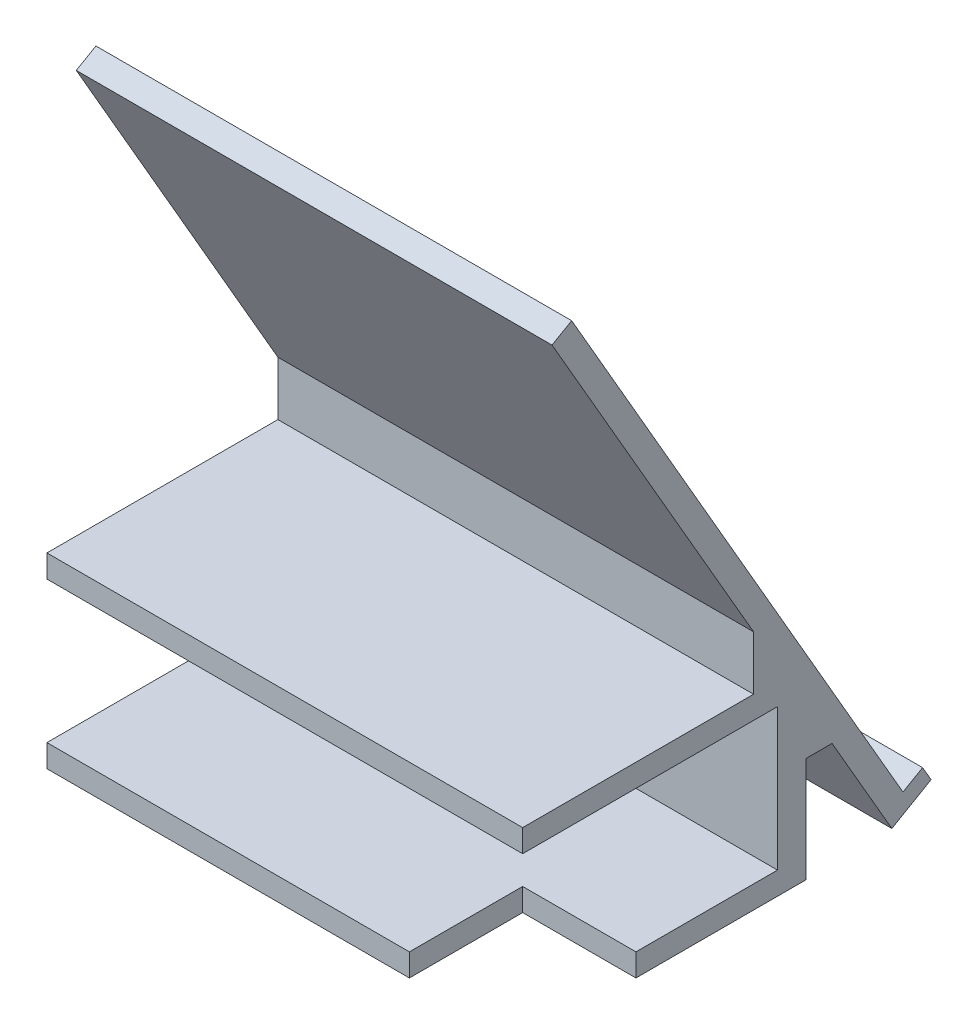
ISO-10303-21;
HEADER;
FILE_DESCRIPTION(('STEP AP214'),'2;1');
FILE_NAME('part.step','',(''),(''),'','','');
FILE_SCHEMA(('AUTOMOTIVE_DESIGN { 1 0 10303 214 1 1 1 1 }'));
ENDSEC;
DATA;
#1=APPLICATION_CONTEXT('core data for automotive mechanical design processes');
#2=APPLICATION_PROTOCOL_DEFINITION('international standard','automotive_design',2000,#1);
#3=PRODUCT_CONTEXT('',#1,'mechanical');
#4=PRODUCT('Part','Part','',(#3));
#5=PRODUCT_RELATED_PRODUCT_CATEGORY('part','',(#4));
#6=PRODUCT_DEFINITION_FORMATION('','',#4);
#7=PRODUCT_DEFINITION_CONTEXT('part definition',#1,'design');
#8=PRODUCT_DEFINITION('design','',#6,#7);
#9=PRODUCT_DEFINITION_SHAPE('','',#8);
#10=(LENGTH_UNIT() NAMED_UNIT(*) SI_UNIT(.MILLI.,.METRE.));
#11=(NAMED_UNIT(*) PLANE_ANGLE_UNIT() SI_UNIT($,.RADIAN.));
#12=(NAMED_UNIT(*) SI_UNIT($,.STERADIAN.) SOLID_ANGLE_UNIT());
#13=UNCERTAINTY_MEASURE_WITH_UNIT(LENGTH_MEASURE(1.E-05),#10,'distance_accuracy_value','');
#14=(GEOMETRIC_REPRESENTATION_CONTEXT(3) GLOBAL_UNCERTAINTY_ASSIGNED_CONTEXT((#13)) GLOBAL_UNIT_ASSIGNED_CONTEXT((#10,
#11,#12)) REPRESENTATION_CONTEXT('',''));
#15=CARTESIAN_POINT('',(0.,0.,0.));
#16=DIRECTION('',(0.,0.,1.));
#17=DIRECTION('',(1.,0.,0.));
#18=AXIS2_PLACEMENT_3D('',#15,#16,#17);
#19=CARTESIAN_POINT('',(0.,0.,0.));
#20=DIRECTION('',(1.,0.,0.));
#21=DIRECTION('',(0.,0.,-1.));
#22=AXIS2_PLACEMENT_3D('',#19,#20,#21);
#23=PLANE('',#22);
#24=DIRECTION('',(0.,0.,1.));
#25=VECTOR('',#24,1.);
#26=CARTESIAN_POINT('',(0.,33.,-50.));
#27=LINE('',#26,#25);
#28=CARTESIAN_POINT('',(0.,33.,-40.7782266286582));
#29=VERTEX_POINT('',#28);
#30=CARTESIAN_POINT('',(0.,33.,0.));
#31=VERTEX_POINT('',#30);
#32=EDGE_CURVE('E414',#29,#31,#27,.T.);
#33=ORIENTED_EDGE('',*,*,#32,.F.);
#34=DIRECTION('',(0.,1.,0.));
#35=VECTOR('',#34,1.);
#36=CARTESIAN_POINT('',(0.,42.5422927604196,-40.7782266286585));
#37=LINE('',#36,#35);
#38=CARTESIAN_POINT('',(0.,42.5422927604196,-40.7782266286527));
#39=VERTEX_POINT('',#38);
#40=EDGE_CURVE('E301',#29,#39,#37,.T.);
#41=ORIENTED_EDGE('',*,*,#40,.T.);
#42=DIRECTION('',(0.,-0.866025403784436,-0.500000000000004));
#43=VECTOR('',#42,1.);
#44=CARTESIAN_POINT('',(0.,28.2930632809514,-49.0050231043686));
#45=LINE('',#44,#43);
#46=CARTESIAN_POINT('',(0.,104.188591785399,-5.18671929203637));
#47=VERTEX_POINT('',#46);
#48=EDGE_CURVE('E273',#47,#39,#45,.T.);
#49=ORIENTED_EDGE('',*,*,#48,.F.);
#50=DIRECTION('',(0.,0.5,-0.866025403784438));
#51=VECTOR('',#50,1.);
#52=CARTESIAN_POINT('',(0.,75.895528504448,43.818303812332));
#53=LINE('',#52,#51);
#54=CARTESIAN_POINT('',(0.,106.188591785399,-8.65082090717412));
#55=VERTEX_POINT('',#54);
#56=EDGE_CURVE('E385',#47,#55,#53,.T.);
#57=ORIENTED_EDGE('',*,*,#56,.T.);
#58=DIRECTION('',(0.,-0.866025403784439,-0.5));
#59=VECTOR('',#58,1.);
#60=CARTESIAN_POINT('',(0.,30.2930632809509,-52.4691247195061));
#61=LINE('',#60,#59);
#62=CARTESIAN_POINT('',(0.,4.86361954262212,-67.1508209071785));
#63=VERTEX_POINT('',#62);
#64=EDGE_CURVE('E381',#55,#63,#61,.T.);
#65=ORIENTED_EDGE('',*,*,#64,.T.);
#66=DIRECTION('',(0.,0.500000000000001,-0.866025403784438));
#67=VECTOR('',#66,1.);
#68=CARTESIAN_POINT('',(0.,6.86361954262212,-70.6149225223162));
#69=LINE('',#68,#67);
#70=CARTESIAN_POINT('',(0.,6.86361954262212,-70.6149225223162));
#71=VERTEX_POINT('',#70);
#72=EDGE_CURVE('E311',#63,#71,#69,.T.);
#73=ORIENTED_EDGE('',*,*,#72,.T.);
#74=DIRECTION('',(0.,-0.866025403784438,-0.500000000000001));
#75=VECTOR('',#74,1.);
#76=CARTESIAN_POINT('',(0.,4.26554333126881,-72.1149225223162));
#77=LINE('',#76,#75);
#78=CARTESIAN_POINT('',(0.,4.26554333126881,-72.1149225223162));
#79=VERTEX_POINT('',#78);
#80=EDGE_CURVE('E308',#71,#79,#77,.T.);
#81=ORIENTED_EDGE('',*,*,#80,.T.);
#82=DIRECTION('',(0.,-0.5,0.866025403784439));
#83=VECTOR('',#82,1.);
#84=CARTESIAN_POINT('',(0.,-28.0275199496846,-16.181696187668));
#85=LINE('',#84,#83);
#86=CARTESIAN_POINT('',(0.,0.265543331266577,-65.1867192920369));
#87=VERTEX_POINT('',#86);
#88=EDGE_CURVE('E267',#79,#87,#85,.T.);
#89=ORIENTED_EDGE('',*,*,#88,.T.);
#90=CARTESIAN_POINT('',(0.,18.5527660011321,-54.6285863608651));
#91=VERTEX_POINT('',#90);
#92=EDGE_CURVE('E262',#91,#87,#45,.T.);
#93=ORIENTED_EDGE('',*,*,#92,.F.);
#94=DIRECTION('',(0.,0.,1.));
#95=VECTOR('',#94,1.);
#96=CARTESIAN_POINT('',(0.,18.5527660011321,-50.));
#97=LINE('',#96,#95);
#98=CARTESIAN_POINT('',(0.,18.5527660011321,-50.));
#99=VERTEX_POINT('',#98);
#100=EDGE_CURVE('E265',#91,#99,#97,.T.);
#101=ORIENTED_EDGE('',*,*,#100,.T.);
#102=DIRECTION('',(0.,1.,0.));
#103=VECTOR('',#102,1.);
#104=CARTESIAN_POINT('',(0.,0.,-50.));
#105=LINE('',#104,#103);
#106=CARTESIAN_POINT('',(0.,0.,-50.));
#107=VERTEX_POINT('',#106);
#108=EDGE_CURVE('E147',#107,#99,#105,.T.);
#109=ORIENTED_EDGE('',*,*,#108,.F.);
#110=DIRECTION('',(0.,0.,-1.));
#111=VECTOR('',#110,1.);
#112=CARTESIAN_POINT('',(0.,0.,0.));
#113=LINE('',#112,#111);
#114=CARTESIAN_POINT('',(0.,0.,0.));
#115=VERTEX_POINT('',#114);
#116=EDGE_CURVE('E352',#115,#107,#113,.T.);
#117=ORIENTED_EDGE('',*,*,#116,.F.);
#118=DIRECTION('',(0.,1.,0.));
#119=VECTOR('',#118,1.);
#120=CARTESIAN_POINT('',(0.,0.,0.));
#121=LINE('',#120,#119);
#122=CARTESIAN_POINT('',(0.,4.,0.));
#123=VERTEX_POINT('',#122);
#124=EDGE_CURVE('E442',#115,#123,#121,.T.);
#125=ORIENTED_EDGE('',*,*,#124,.T.);
#126=DIRECTION('',(0.,0.,-1.));
#127=VECTOR('',#126,1.);
#128=CARTESIAN_POINT('',(0.,4.,0.));
#129=LINE('',#128,#127);
#130=CARTESIAN_POINT('',(0.,4.,-45.));
#131=VERTEX_POINT('',#130);
#132=EDGE_CURVE('E348',#123,#131,#129,.T.);
#133=ORIENTED_EDGE('',*,*,#132,.T.);
#134=DIRECTION('',(0.,1.,0.));
#135=VECTOR('',#134,1.);
#136=CARTESIAN_POINT('',(0.,0.,-45.));
#137=LINE('',#136,#135);
#138=CARTESIAN_POINT('',(0.,29.,-45.));
#139=VERTEX_POINT('',#138);
#140=EDGE_CURVE('E389',#131,#139,#137,.T.);
#141=ORIENTED_EDGE('',*,*,#140,.T.);
#142=DIRECTION('',(0.,0.,1.));
#143=VECTOR('',#142,1.);
#144=CARTESIAN_POINT('',(0.,29.,-50.));
#145=LINE('',#144,#143);
#146=CARTESIAN_POINT('',(0.,29.,0.));
#147=VERTEX_POINT('',#146);
#148=EDGE_CURVE('E422',#139,#147,#145,.T.);
#149=ORIENTED_EDGE('',*,*,#148,.T.);
#150=DIRECTION('',(0.,-1.,0.));
#151=VECTOR('',#150,1.);
#152=CARTESIAN_POINT('',(0.,33.,0.));
#153=LINE('',#152,#151);
#154=EDGE_CURVE('E425',#31,#147,#153,.T.);
#155=ORIENTED_EDGE('',*,*,#154,.F.);
#156=EDGE_LOOP('',(#33,#41,#49,#57,#65,#73,#81,#89,#93,#101,#109,#117,#125,#133,#141,#149,#155));
#157=FACE_BOUND('',#156,.T.);
#158=ADVANCED_FACE('F131',(#157),#23,.F.);
#159=CARTESIAN_POINT('',(84.,0.,0.));
#160=DIRECTION('',(0.,1.,0.));
#161=DIRECTION('',(0.,0.,1.));
#162=AXIS2_PLACEMENT_3D('',#159,#160,#161);
#163=PLANE('',#162);
#164=DIRECTION('',(0.,0.,-1.));
#165=VECTOR('',#164,1.);
#166=CARTESIAN_POINT('',(84.,0.,0.));
#167=LINE('',#166,#165);
#168=CARTESIAN_POINT('',(84.,0.,-20.));
#169=VERTEX_POINT('',#168);
#170=CARTESIAN_POINT('',(84.,0.,-50.));
#171=VERTEX_POINT('',#170);
#172=EDGE_CURVE('E372',#169,#171,#167,.T.);
#173=ORIENTED_EDGE('',*,*,#172,.F.);
#174=DIRECTION('',(1.,0.,0.));
#175=VECTOR('',#174,1.);
#176=CARTESIAN_POINT('',(64.,0.,-20.));
#177=LINE('',#176,#175);
#178=CARTESIAN_POINT('',(64.,0.,-20.));
#179=VERTEX_POINT('',#178);
#180=EDGE_CURVE('E335',#179,#169,#177,.T.);
#181=ORIENTED_EDGE('',*,*,#180,.F.);
#182=DIRECTION('',(0.,0.,-1.));
#183=VECTOR('',#182,1.);
#184=CARTESIAN_POINT('',(64.,0.,0.));
#185=LINE('',#184,#183);
#186=CARTESIAN_POINT('',(64.,0.,0.));
#187=VERTEX_POINT('',#186);
#188=EDGE_CURVE('E315',#187,#179,#185,.T.);
#189=ORIENTED_EDGE('',*,*,#188,.F.);
#190=DIRECTION('',(-1.,0.,0.));
#191=VECTOR('',#190,1.);
#192=CARTESIAN_POINT('',(84.,0.,0.));
#193=LINE('',#192,#191);
#194=EDGE_CURVE('E441',#187,#115,#193,.T.);
#195=ORIENTED_EDGE('',*,*,#194,.T.);
#196=ORIENTED_EDGE('',*,*,#116,.T.);
#197=DIRECTION('',(-1.,0.,0.));
#198=VECTOR('',#197,1.);
#199=CARTESIAN_POINT('',(84.,0.,-50.));
#200=LINE('',#199,#198);
#201=EDGE_CURVE('E375',#171,#107,#200,.T.);
#202=ORIENTED_EDGE('',*,*,#201,.F.);
#203=EDGE_LOOP('',(#173,#181,#189,#195,#196,#202));
#204=FACE_BOUND('',#203,.T.);
#205=ADVANCED_FACE('F467',(#204),#163,.F.);
#206=CARTESIAN_POINT('',(84.,0.,0.));
#207=DIRECTION('',(1.,0.,0.));
#208=DIRECTION('',(0.,0.,-1.));
#209=AXIS2_PLACEMENT_3D('',#206,#207,#208);
#210=PLANE('',#209);
#211=DIRECTION('',(0.,1.,0.));
#212=VECTOR('',#211,1.);
#213=CARTESIAN_POINT('',(84.,0.,-50.));
#214=LINE('',#213,#212);
#215=CARTESIAN_POINT('',(84.,18.5527660011321,-50.));
#216=VERTEX_POINT('',#215);
#217=EDGE_CURVE('E349',#171,#216,#214,.T.);
#218=ORIENTED_EDGE('',*,*,#217,.T.);
#219=DIRECTION('',(0.,0.,-1.));
#220=VECTOR('',#219,1.);
#221=CARTESIAN_POINT('',(84.,18.5527660011321,-50.));
#222=LINE('',#221,#220);
#223=CARTESIAN_POINT('',(84.,18.5527660011321,-54.6285863608593));
#224=VERTEX_POINT('',#223);
#225=EDGE_CURVE('E292',#216,#224,#222,.T.);
#226=ORIENTED_EDGE('',*,*,#225,.T.);
#227=DIRECTION('',(0.,-0.866025403784436,-0.500000000000004));
#228=VECTOR('',#227,1.);
#229=CARTESIAN_POINT('',(84.,28.2930632809514,-49.0050231043686));
#230=LINE('',#229,#228);
#231=CARTESIAN_POINT('',(84.,0.265543331266577,-65.1867192920369));
#232=VERTEX_POINT('',#231);
#233=EDGE_CURVE('E277',#224,#232,#230,.T.);
#234=ORIENTED_EDGE('',*,*,#233,.T.);
#235=DIRECTION('',(0.,-0.5,0.866025403784439));
#236=VECTOR('',#235,1.);
#237=CARTESIAN_POINT('',(84.,-28.0275199496846,-16.181696187668));
#238=LINE('',#237,#236);
#239=CARTESIAN_POINT('',(84.,4.26554333126881,-72.1149225223162));
#240=VERTEX_POINT('',#239);
#241=EDGE_CURVE('E355',#240,#232,#238,.T.);
#242=ORIENTED_EDGE('',*,*,#241,.F.);
#243=DIRECTION('',(0.,0.866025403784438,0.500000000000001));
#244=VECTOR('',#243,1.);
#245=CARTESIAN_POINT('',(84.,4.26554333126881,-72.1149225223162));
#246=LINE('',#245,#244);
#247=CARTESIAN_POINT('',(84.,6.86361954262212,-70.6149225223162));
#248=VERTEX_POINT('',#247);
#249=EDGE_CURVE('E307',#240,#248,#246,.T.);
#250=ORIENTED_EDGE('',*,*,#249,.T.);
#251=DIRECTION('',(0.,-0.500000000000001,0.866025403784438));
#252=VECTOR('',#251,1.);
#253=CARTESIAN_POINT('',(84.,6.86361954262212,-70.6149225223162));
#254=LINE('',#253,#252);
#255=CARTESIAN_POINT('',(84.,4.86361954262212,-67.1508209071785));
#256=VERTEX_POINT('',#255);
#257=EDGE_CURVE('E319',#248,#256,#254,.T.);
#258=ORIENTED_EDGE('',*,*,#257,.T.);
#259=DIRECTION('',(0.,-0.866025403784439,-0.5));
#260=VECTOR('',#259,1.);
#261=CARTESIAN_POINT('',(84.,30.2930632809509,-52.4691247195061));
#262=LINE('',#261,#260);
#263=CARTESIAN_POINT('',(84.,106.188591785399,-8.65082090717412));
#264=VERTEX_POINT('',#263);
#265=EDGE_CURVE('E360',#264,#256,#262,.T.);
#266=ORIENTED_EDGE('',*,*,#265,.F.);
#267=DIRECTION('',(0.,0.5,-0.866025403784438));
#268=VECTOR('',#267,1.);
#269=CARTESIAN_POINT('',(84.,75.895528504448,43.818303812332));
#270=LINE('',#269,#268);
#271=CARTESIAN_POINT('',(84.,104.188591785399,-5.18671929203637));
#272=VERTEX_POINT('',#271);
#273=EDGE_CURVE('E364',#272,#264,#270,.T.);
#274=ORIENTED_EDGE('',*,*,#273,.F.);
#275=CARTESIAN_POINT('',(84.,42.5422927604196,-40.7782266286527));
#276=VERTEX_POINT('',#275);
#277=EDGE_CURVE('E356',#272,#276,#230,.T.);
#278=ORIENTED_EDGE('',*,*,#277,.T.);
#279=DIRECTION('',(0.,-1.,0.));
#280=VECTOR('',#279,1.);
#281=CARTESIAN_POINT('',(84.,42.5422927604196,-40.7782266286585));
#282=LINE('',#281,#280);
#283=CARTESIAN_POINT('',(84.,33.,-40.7782266286582));
#284=VERTEX_POINT('',#283);
#285=EDGE_CURVE('E285',#276,#284,#282,.T.);
#286=ORIENTED_EDGE('',*,*,#285,.T.);
#287=DIRECTION('',(0.,0.,1.));
#288=VECTOR('',#287,1.);
#289=CARTESIAN_POINT('',(84.,33.,-50.));
#290=LINE('',#289,#288);
#291=CARTESIAN_POINT('',(84.,33.,0.));
#292=VERTEX_POINT('',#291);
#293=EDGE_CURVE('E418',#284,#292,#290,.T.);
#294=ORIENTED_EDGE('',*,*,#293,.T.);
#295=DIRECTION('',(0.,-1.,0.));
#296=VECTOR('',#295,1.);
#297=CARTESIAN_POINT('',(84.,33.,0.));
#298=LINE('',#297,#296);
#299=CARTESIAN_POINT('',(84.,29.,0.));
#300=VERTEX_POINT('',#299);
#301=EDGE_CURVE('E413',#292,#300,#298,.T.);
#302=ORIENTED_EDGE('',*,*,#301,.T.);
#303=DIRECTION('',(0.,0.,1.));
#304=VECTOR('',#303,1.);
#305=CARTESIAN_POINT('',(84.,29.,-50.));
#306=LINE('',#305,#304);
#307=CARTESIAN_POINT('',(84.,29.,-45.));
#308=VERTEX_POINT('',#307);
#309=EDGE_CURVE('E410',#308,#300,#306,.T.);
#310=ORIENTED_EDGE('',*,*,#309,.F.);
#311=DIRECTION('',(0.,1.,0.));
#312=VECTOR('',#311,1.);
#313=CARTESIAN_POINT('',(84.,0.,-45.));
#314=LINE('',#313,#312);
#315=CARTESIAN_POINT('',(84.,4.,-45.));
#316=VERTEX_POINT('',#315);
#317=EDGE_CURVE('E368',#316,#308,#314,.T.);
#318=ORIENTED_EDGE('',*,*,#317,.F.);
#319=DIRECTION('',(0.,0.,-1.));
#320=VECTOR('',#319,1.);
#321=CARTESIAN_POINT('',(84.,4.,0.));
#322=LINE('',#321,#320);
#323=CARTESIAN_POINT('',(84.,4.,-20.));
#324=VERTEX_POINT('',#323);
#325=EDGE_CURVE('E438',#324,#316,#322,.T.);
#326=ORIENTED_EDGE('',*,*,#325,.F.);
#327=DIRECTION('',(0.,-1.,0.));
#328=VECTOR('',#327,1.);
#329=CARTESIAN_POINT('',(84.,14.,-20.));
#330=LINE('',#329,#328);
#331=EDGE_CURVE('E339',#324,#169,#330,.T.);
#332=ORIENTED_EDGE('',*,*,#331,.T.);
#333=ORIENTED_EDGE('',*,*,#172,.T.);
#334=EDGE_LOOP('',(#218,#226,#234,#242,#250,#258,#266,#274,#278,#286,#294,#302,#310,#318,#326,
#332,#333));
#335=FACE_BOUND('',#334,.T.);
#336=ADVANCED_FACE('F476',(#335),#210,.T.);
#337=CARTESIAN_POINT('',(84.,0.,-50.));
#338=DIRECTION('',(0.,0.,1.));
#339=DIRECTION('',(1.,0.,0.));
#340=AXIS2_PLACEMENT_3D('',#337,#338,#339);
#341=PLANE('',#340);
#342=ORIENTED_EDGE('',*,*,#108,.T.);
#343=DIRECTION('',(1.,0.,0.));
#344=VECTOR('',#343,1.);
#345=CARTESIAN_POINT('',(-11.0184905878263,18.5527660011321,-50.));
#346=LINE('',#345,#344);
#347=EDGE_CURVE('E152',#99,#216,#346,.T.);
#348=ORIENTED_EDGE('',*,*,#347,.T.);
#349=ORIENTED_EDGE('',*,*,#217,.F.);
#350=ORIENTED_EDGE('',*,*,#201,.T.);
#351=EDGE_LOOP('',(#342,#348,#349,#350));
#352=FACE_BOUND('',#351,.T.);
#353=ADVANCED_FACE('F474',(#352),#341,.F.);
#354=CARTESIAN_POINT('',(84.,28.2930632809514,-49.0050231043686));
#355=DIRECTION('',(0.,0.500000000000004,-0.866025403784436));
#356=DIRECTION('',(0.,0.866025403784436,0.500000000000004));
#357=AXIS2_PLACEMENT_3D('',#354,#355,#356);
#358=PLANE('',#357);
#359=ORIENTED_EDGE('',*,*,#233,.F.);
#360=DIRECTION('',(1.,0.,0.));
#361=VECTOR('',#360,1.);
#362=CARTESIAN_POINT('',(-11.0184905878263,18.5527660011321,-54.6285863608651));
#363=LINE('',#362,#361);
#364=EDGE_CURVE('E275',#91,#224,#363,.T.);
#365=ORIENTED_EDGE('',*,*,#364,.F.);
#366=ORIENTED_EDGE('',*,*,#92,.T.);
#367=DIRECTION('',(-1.,0.,0.));
#368=VECTOR('',#367,1.);
#369=CARTESIAN_POINT('',(84.,0.265543331266577,-65.1867192920369));
#370=LINE('',#369,#368);
#371=EDGE_CURVE('E406',#232,#87,#370,.T.);
#372=ORIENTED_EDGE('',*,*,#371,.F.);
#373=EDGE_LOOP('',(#359,#365,#366,#372));
#374=FACE_BOUND('',#373,.T.);
#375=ADVANCED_FACE('F276',(#374),#358,.F.);
#376=CARTESIAN_POINT('',(84.,-28.0275199496846,-16.181696187668));
#377=DIRECTION('',(0.,-0.866025403784439,-0.5));
#378=DIRECTION('',(0.,0.5,-0.866025403784439));
#379=AXIS2_PLACEMENT_3D('',#376,#377,#378);
#380=PLANE('',#379);
#381=ORIENTED_EDGE('',*,*,#88,.F.);
#382=DIRECTION('',(1.,0.,0.));
#383=VECTOR('',#382,1.);
#384=CARTESIAN_POINT('',(-11.0184905878263,4.26554333126881,-72.1149225223162));
#385=LINE('',#384,#383);
#386=EDGE_CURVE('E323',#79,#240,#385,.T.);
#387=ORIENTED_EDGE('',*,*,#386,.T.);
#388=ORIENTED_EDGE('',*,*,#241,.T.);
#389=ORIENTED_EDGE('',*,*,#371,.T.);
#390=EDGE_LOOP('',(#381,#387,#388,#389));
#391=FACE_BOUND('',#390,.T.);
#392=ADVANCED_FACE('F527',(#391),#380,.T.);
#393=CARTESIAN_POINT('',(84.,30.2930632809509,-52.4691247195061));
#394=DIRECTION('',(0.,0.5,-0.866025403784439));
#395=DIRECTION('',(0.,0.866025403784439,0.5));
#396=AXIS2_PLACEMENT_3D('',#393,#394,#395);
#397=PLANE('',#396);
#398=DIRECTION('',(1.,0.,0.));
#399=VECTOR('',#398,1.);
#400=CARTESIAN_POINT('',(-11.0184905878263,4.86361954262212,-67.1508209071785));
#401=LINE('',#400,#399);
#402=EDGE_CURVE('E312',#63,#256,#401,.T.);
#403=ORIENTED_EDGE('',*,*,#402,.F.);
#404=ORIENTED_EDGE('',*,*,#64,.F.);
#405=DIRECTION('',(-1.,0.,0.));
#406=VECTOR('',#405,1.);
#407=CARTESIAN_POINT('',(84.,106.188591785399,-8.65082090717412));
#408=LINE('',#407,#406);
#409=EDGE_CURVE('E403',#264,#55,#408,.T.);
#410=ORIENTED_EDGE('',*,*,#409,.F.);
#411=ORIENTED_EDGE('',*,*,#265,.T.);
#412=EDGE_LOOP('',(#403,#404,#410,#411));
#413=FACE_BOUND('',#412,.T.);
#414=ADVANCED_FACE('F516',(#413),#397,.T.);
#415=CARTESIAN_POINT('',(84.,75.895528504448,43.818303812332));
#416=DIRECTION('',(0.,0.866025403784438,0.5));
#417=DIRECTION('',(0.,-0.5,0.866025403784439));
#418=AXIS2_PLACEMENT_3D('',#415,#416,#417);
#419=PLANE('',#418);
#420=ORIENTED_EDGE('',*,*,#56,.F.);
#421=DIRECTION('',(-1.,0.,0.));
#422=VECTOR('',#421,1.);
#423=CARTESIAN_POINT('',(84.,104.188591785399,-5.18671929203637));
#424=LINE('',#423,#422);
#425=EDGE_CURVE('E400',#272,#47,#424,.T.);
#426=ORIENTED_EDGE('',*,*,#425,.F.);
#427=ORIENTED_EDGE('',*,*,#273,.T.);
#428=ORIENTED_EDGE('',*,*,#409,.T.);
#429=EDGE_LOOP('',(#420,#426,#427,#428));
#430=FACE_BOUND('',#429,.T.);
#431=ADVANCED_FACE('F509',(#430),#419,.T.);
#432=ORIENTED_EDGE('',*,*,#48,.T.);
#433=DIRECTION('',(1.,0.,0.));
#434=VECTOR('',#433,1.);
#435=CARTESIAN_POINT('',(-11.0184905878263,42.5422927604196,-40.7782266286585));
#436=LINE('',#435,#434);
#437=EDGE_CURVE('E289',#39,#276,#436,.T.);
#438=ORIENTED_EDGE('',*,*,#437,.T.);
#439=ORIENTED_EDGE('',*,*,#277,.F.);
#440=ORIENTED_EDGE('',*,*,#425,.T.);
#441=EDGE_LOOP('',(#432,#438,#439,#440));
#442=FACE_BOUND('',#441,.T.);
#443=ADVANCED_FACE('F536',(#442),#358,.F.);
#444=CARTESIAN_POINT('',(84.,0.,-45.));
#445=DIRECTION('',(0.,0.,1.));
#446=DIRECTION('',(1.,0.,0.));
#447=AXIS2_PLACEMENT_3D('',#444,#445,#446);
#448=PLANE('',#447);
#449=DIRECTION('',(-1.,0.,0.));
#450=VECTOR('',#449,1.);
#451=CARTESIAN_POINT('',(84.,4.,-45.));
#452=LINE('',#451,#450);
#453=EDGE_CURVE('E409',#316,#131,#452,.T.);
#454=ORIENTED_EDGE('',*,*,#453,.F.);
#455=ORIENTED_EDGE('',*,*,#317,.T.);
#456=DIRECTION('',(-1.,0.,0.));
#457=VECTOR('',#456,1.);
#458=CARTESIAN_POINT('',(84.,29.,-45.));
#459=LINE('',#458,#457);
#460=EDGE_CURVE('E397',#308,#139,#459,.T.);
#461=ORIENTED_EDGE('',*,*,#460,.T.);
#462=ORIENTED_EDGE('',*,*,#140,.F.);
#463=EDGE_LOOP('',(#454,#455,#461,#462));
#464=FACE_BOUND('',#463,.T.);
#465=ADVANCED_FACE('F485',(#464),#448,.T.);
#466=CARTESIAN_POINT('',(84.,4.,0.));
#467=DIRECTION('',(0.,1.,0.));
#468=DIRECTION('',(0.,0.,1.));
#469=AXIS2_PLACEMENT_3D('',#466,#467,#468);
#470=PLANE('',#469);
#471=DIRECTION('',(-1.,0.,0.));
#472=VECTOR('',#471,1.);
#473=CARTESIAN_POINT('',(84.,4.,-20.));
#474=LINE('',#473,#472);
#475=CARTESIAN_POINT('',(64.,4.,-20.));
#476=VERTEX_POINT('',#475);
#477=EDGE_CURVE('E12',#324,#476,#474,.T.);
#478=ORIENTED_EDGE('',*,*,#477,.F.);
#479=ORIENTED_EDGE('',*,*,#325,.T.);
#480=ORIENTED_EDGE('',*,*,#453,.T.);
#481=ORIENTED_EDGE('',*,*,#132,.F.);
#482=DIRECTION('',(-1.,0.,0.));
#483=VECTOR('',#482,1.);
#484=CARTESIAN_POINT('',(84.,4.,0.));
#485=LINE('',#484,#483);
#486=CARTESIAN_POINT('',(64.,4.,0.));
#487=VERTEX_POINT('',#486);
#488=EDGE_CURVE('E426',#487,#123,#485,.T.);
#489=ORIENTED_EDGE('',*,*,#488,.F.);
#490=DIRECTION('',(0.,0.,1.));
#491=VECTOR('',#490,1.);
#492=CARTESIAN_POINT('',(64.,4.,0.));
#493=LINE('',#492,#491);
#494=EDGE_CURVE('E343',#476,#487,#493,.T.);
#495=ORIENTED_EDGE('',*,*,#494,.F.);
#496=EDGE_LOOP('',(#478,#479,#480,#481,#489,#495));
#497=FACE_BOUND('',#496,.T.);
#498=ADVANCED_FACE('F133',(#497),#470,.T.);
#499=CARTESIAN_POINT('',(84.,0.,0.));
#500=DIRECTION('',(0.,0.,1.));
#501=DIRECTION('',(1.,0.,0.));
#502=AXIS2_PLACEMENT_3D('',#499,#500,#501);
#503=PLANE('',#502);
#504=DIRECTION('',(0.,-1.,0.));
#505=VECTOR('',#504,1.);
#506=CARTESIAN_POINT('',(64.,0.,0.));
#507=LINE('',#506,#505);
#508=EDGE_CURVE('E140',#487,#187,#507,.T.);
#509=ORIENTED_EDGE('',*,*,#508,.F.);
#510=ORIENTED_EDGE('',*,*,#488,.T.);
#511=ORIENTED_EDGE('',*,*,#124,.F.);
#512=ORIENTED_EDGE('',*,*,#194,.F.);
#513=EDGE_LOOP('',(#509,#510,#511,#512));
#514=FACE_BOUND('',#513,.T.);
#515=ADVANCED_FACE('F470',(#514),#503,.T.);
#516=CARTESIAN_POINT('',(84.,33.,-50.));
#517=DIRECTION('',(0.,-1.,0.));
#518=DIRECTION('',(0.,0.,-1.));
#519=AXIS2_PLACEMENT_3D('',#516,#517,#518);
#520=PLANE('',#519);
#521=ORIENTED_EDGE('',*,*,#293,.F.);
#522=DIRECTION('',(1.,0.,0.));
#523=VECTOR('',#522,1.);
#524=CARTESIAN_POINT('',(-11.0184905878263,33.,-40.7782266286582));
#525=LINE('',#524,#523);
#526=EDGE_CURVE('E297',#29,#284,#525,.T.);
#527=ORIENTED_EDGE('',*,*,#526,.F.);
#528=ORIENTED_EDGE('',*,*,#32,.T.);
#529=DIRECTION('',(-1.,0.,0.));
#530=VECTOR('',#529,1.);
#531=CARTESIAN_POINT('',(84.,33.,0.));
#532=LINE('',#531,#530);
#533=EDGE_CURVE('E377',#292,#31,#532,.T.);
#534=ORIENTED_EDGE('',*,*,#533,.F.);
#535=EDGE_LOOP('',(#521,#527,#528,#534));
#536=FACE_BOUND('',#535,.T.);
#537=ADVANCED_FACE('F498',(#536),#520,.F.);
#538=CARTESIAN_POINT('',(84.,33.,0.));
#539=DIRECTION('',(0.,0.,-1.));
#540=DIRECTION('',(0.,1.,0.));
#541=AXIS2_PLACEMENT_3D('',#538,#539,#540);
#542=PLANE('',#541);
#543=ORIENTED_EDGE('',*,*,#154,.T.);
#544=DIRECTION('',(-1.,0.,0.));
#545=VECTOR('',#544,1.);
#546=CARTESIAN_POINT('',(84.,29.,0.));
#547=LINE('',#546,#545);
#548=EDGE_CURVE('E421',#300,#147,#547,.T.);
#549=ORIENTED_EDGE('',*,*,#548,.F.);
#550=ORIENTED_EDGE('',*,*,#301,.F.);
#551=ORIENTED_EDGE('',*,*,#533,.T.);
#552=EDGE_LOOP('',(#543,#549,#550,#551));
#553=FACE_BOUND('',#552,.T.);
#554=ADVANCED_FACE('F495',(#553),#542,.F.);
#555=CARTESIAN_POINT('',(84.,29.,-50.));
#556=DIRECTION('',(0.,-1.,0.));
#557=DIRECTION('',(0.,0.,-1.));
#558=AXIS2_PLACEMENT_3D('',#555,#556,#557);
#559=PLANE('',#558);
#560=ORIENTED_EDGE('',*,*,#148,.F.);
#561=ORIENTED_EDGE('',*,*,#460,.F.);
#562=ORIENTED_EDGE('',*,*,#309,.T.);
#563=ORIENTED_EDGE('',*,*,#548,.T.);
#564=EDGE_LOOP('',(#560,#561,#562,#563));
#565=FACE_BOUND('',#564,.T.);
#566=ADVANCED_FACE('F491',(#565),#559,.T.);
#567=CARTESIAN_POINT('',(64.,14.,-20.));
#568=DIRECTION('',(0.,0.,-1.));
#569=DIRECTION('',(0.,1.,0.));
#570=AXIS2_PLACEMENT_3D('',#567,#568,#569);
#571=PLANE('',#570);
#572=ORIENTED_EDGE('',*,*,#477,.T.);
#573=DIRECTION('',(0.,-1.,0.));
#574=VECTOR('',#573,1.);
#575=CARTESIAN_POINT('',(64.,14.,-20.));
#576=LINE('',#575,#574);
#577=EDGE_CURVE('E338',#476,#179,#576,.T.);
#578=ORIENTED_EDGE('',*,*,#577,.T.);
#579=ORIENTED_EDGE('',*,*,#180,.T.);
#580=ORIENTED_EDGE('',*,*,#331,.F.);
#581=EDGE_LOOP('',(#572,#578,#579,#580));
#582=FACE_BOUND('',#581,.T.);
#583=ADVANCED_FACE('F481',(#582),#571,.F.);
#584=CARTESIAN_POINT('',(64.,14.,0.));
#585=DIRECTION('',(-1.,0.,0.));
#586=DIRECTION('',(0.,0.,1.));
#587=AXIS2_PLACEMENT_3D('',#584,#585,#586);
#588=PLANE('',#587);
#589=ORIENTED_EDGE('',*,*,#494,.T.);
#590=ORIENTED_EDGE('',*,*,#508,.T.);
#591=ORIENTED_EDGE('',*,*,#188,.T.);
#592=ORIENTED_EDGE('',*,*,#577,.F.);
#593=EDGE_LOOP('',(#589,#590,#591,#592));
#594=FACE_BOUND('',#593,.T.);
#595=ADVANCED_FACE('F458',(#594),#588,.F.);
#596=CARTESIAN_POINT('',(-11.0184905878263,6.86361954262212,-70.6149225223162));
#597=DIRECTION('',(0.,0.866025403784438,0.500000000000001));
#598=DIRECTION('',(0.,-0.500000000000001,0.866025403784438));
#599=AXIS2_PLACEMENT_3D('',#596,#597,#598);
#600=PLANE('',#599);
#601=ORIENTED_EDGE('',*,*,#72,.F.);
#602=ORIENTED_EDGE('',*,*,#402,.T.);
#603=ORIENTED_EDGE('',*,*,#257,.F.);
#604=DIRECTION('',(1.,0.,0.));
#605=VECTOR('',#604,1.);
#606=CARTESIAN_POINT('',(-11.0184905878263,6.86361954262212,-70.6149225223162));
#607=LINE('',#606,#605);
#608=EDGE_CURVE('E326',#71,#248,#607,.T.);
#609=ORIENTED_EDGE('',*,*,#608,.F.);
#610=EDGE_LOOP('',(#601,#602,#603,#609));
#611=FACE_BOUND('',#610,.T.);
#612=ADVANCED_FACE('F525',(#611),#600,.T.);
#613=CARTESIAN_POINT('',(-11.0184905878263,4.26554333126881,-72.1149225223162));
#614=DIRECTION('',(0.,0.500000000000001,-0.866025403784438));
#615=DIRECTION('',(0.,0.866025403784438,0.500000000000001));
#616=AXIS2_PLACEMENT_3D('',#613,#614,#615);
#617=PLANE('',#616);
#618=ORIENTED_EDGE('',*,*,#80,.F.);
#619=ORIENTED_EDGE('',*,*,#608,.T.);
#620=ORIENTED_EDGE('',*,*,#249,.F.);
#621=ORIENTED_EDGE('',*,*,#386,.F.);
#622=EDGE_LOOP('',(#618,#619,#620,#621));
#623=FACE_BOUND('',#622,.T.);
#624=ADVANCED_FACE('F522',(#623),#617,.T.);
#625=CARTESIAN_POINT('',(-11.0184905878263,42.5422927604196,-40.7782266286585));
#626=DIRECTION('',(0.,0.,1.));
#627=DIRECTION('',(0.,-1.,0.));
#628=AXIS2_PLACEMENT_3D('',#625,#626,#627);
#629=PLANE('',#628);
#630=ORIENTED_EDGE('',*,*,#40,.F.);
#631=ORIENTED_EDGE('',*,*,#526,.T.);
#632=ORIENTED_EDGE('',*,*,#285,.F.);
#633=ORIENTED_EDGE('',*,*,#437,.F.);
#634=EDGE_LOOP('',(#630,#631,#632,#633));
#635=FACE_BOUND('',#634,.T.);
#636=ADVANCED_FACE('F503',(#635),#629,.T.);
#637=CARTESIAN_POINT('',(-11.0184905878263,18.5527660011321,-50.));
#638=DIRECTION('',(0.,-1.,0.));
#639=DIRECTION('',(0.,0.,-1.));
#640=AXIS2_PLACEMENT_3D('',#637,#638,#639);
#641=PLANE('',#640);
#642=ORIENTED_EDGE('',*,*,#100,.F.);
#643=ORIENTED_EDGE('',*,*,#364,.T.);
#644=ORIENTED_EDGE('',*,*,#225,.F.);
#645=ORIENTED_EDGE('',*,*,#347,.F.);
#646=EDGE_LOOP('',(#642,#643,#644,#645));
#647=FACE_BOUND('',#646,.T.);
#648=ADVANCED_FACE('F283',(#647),#641,.T.);
#649=CLOSED_SHELL('',(#158,#205,#336,#353,#375,#392,#414,#431,#443,#465,#498,#515,#537,#554,
#566,#583,#595,#612,#624,#636,#648));
#650=MANIFOLD_SOLID_BREP('B2',#649);
#651=ADVANCED_BREP_SHAPE_REPRESENTATION('',(#18,#650),#14);
#652=SHAPE_DEFINITION_REPRESENTATION(#9,#651);
ENDSEC;
END-ISO-10303-21;
